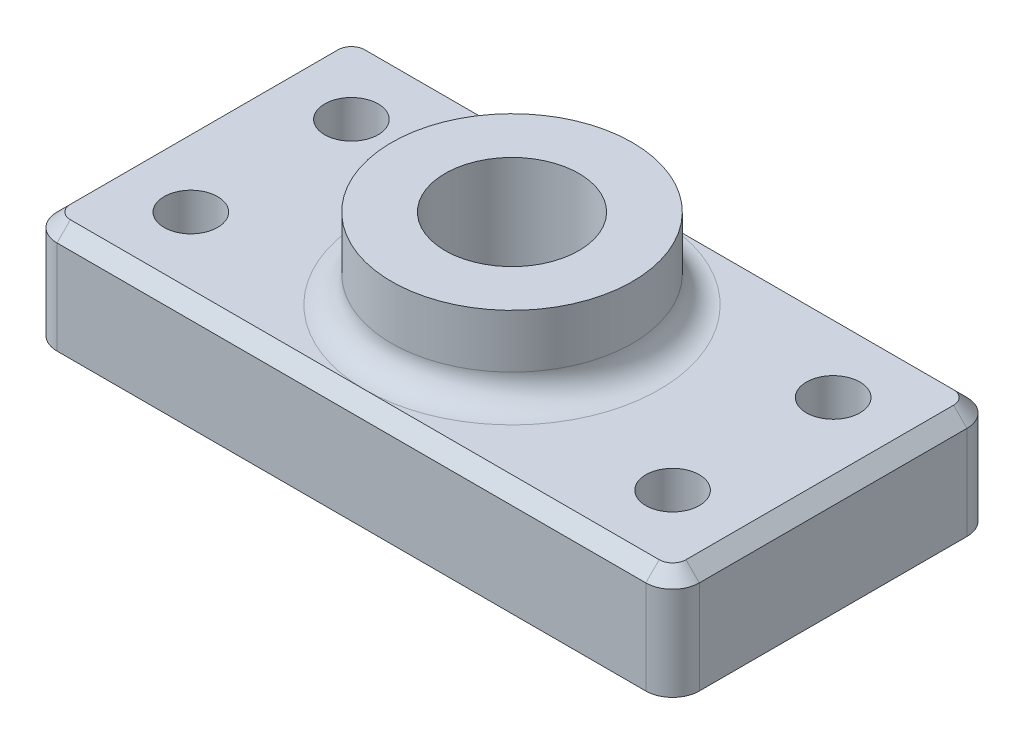
ISO-10303-21;
HEADER;
FILE_DESCRIPTION(('STEP AP214'),'2;1');
FILE_NAME('part.step','',(''),(''),'','','');
FILE_SCHEMA(('AUTOMOTIVE_DESIGN { 1 0 10303 214 1 1 1 1 }'));
ENDSEC;
DATA;
#1=APPLICATION_CONTEXT('core data for automotive mechanical design processes');
#2=APPLICATION_PROTOCOL_DEFINITION('international standard','automotive_design',2000,#1);
#3=PRODUCT_CONTEXT('',#1,'mechanical');
#4=PRODUCT('Part','Part','',(#3));
#5=PRODUCT_RELATED_PRODUCT_CATEGORY('part','',(#4));
#6=PRODUCT_DEFINITION_FORMATION('','',#4);
#7=PRODUCT_DEFINITION_CONTEXT('part definition',#1,'design');
#8=PRODUCT_DEFINITION('design','',#6,#7);
#9=PRODUCT_DEFINITION_SHAPE('','',#8);
#10=(LENGTH_UNIT() NAMED_UNIT(*) SI_UNIT(.MILLI.,.METRE.));
#11=(NAMED_UNIT(*) PLANE_ANGLE_UNIT() SI_UNIT($,.RADIAN.));
#12=(NAMED_UNIT(*) SI_UNIT($,.STERADIAN.) SOLID_ANGLE_UNIT());
#13=UNCERTAINTY_MEASURE_WITH_UNIT(LENGTH_MEASURE(1.E-05),#10,'distance_accuracy_value','');
#14=(GEOMETRIC_REPRESENTATION_CONTEXT(3) GLOBAL_UNCERTAINTY_ASSIGNED_CONTEXT((#13)) GLOBAL_UNIT_ASSIGNED_CONTEXT((#10,
#11,#12)) REPRESENTATION_CONTEXT('',''));
#15=CARTESIAN_POINT('',(0.,0.,0.));
#16=DIRECTION('',(0.,0.,1.));
#17=DIRECTION('',(1.,0.,0.));
#18=AXIS2_PLACEMENT_3D('',#15,#16,#17);
#19=CARTESIAN_POINT('',(0.,25.4,0.));
#20=DIRECTION('',(0.,-1.,0.));
#21=DIRECTION('',(0.,0.,-1.));
#22=AXIS2_PLACEMENT_3D('',#19,#20,#21);
#23=PLANE('',#22);
#24=CARTESIAN_POINT('',(133.35,25.4,-19.05));
#25=DIRECTION('',(0.,1.,0.));
#26=DIRECTION('',(0.,0.,1.));
#27=AXIS2_PLACEMENT_3D('',#24,#25,#26);
#28=CIRCLE('',#27,6.35);
#29=CARTESIAN_POINT('',(133.35,25.4,-12.7));
#30=VERTEX_POINT('',#29);
#31=EDGE_CURVE('E391',#30,#30,#28,.T.);
#32=ORIENTED_EDGE('',*,*,#31,.F.);
#33=EDGE_LOOP('',(#32));
#34=FACE_BOUND('',#33,.T.);
#35=DIRECTION('',(-1.,0.,0.));
#36=VECTOR('',#35,1.);
#37=CARTESIAN_POINT('',(0.,25.4,-73.025));
#38=LINE('',#37,#36);
#39=CARTESIAN_POINT('',(146.05,25.4,-73.025));
#40=VERTEX_POINT('',#39);
#41=CARTESIAN_POINT('',(76.2,25.4,-73.025));
#42=VERTEX_POINT('',#41);
#43=EDGE_CURVE('E230',#40,#42,#38,.T.);
#44=ORIENTED_EDGE('',*,*,#43,.T.);
#45=CARTESIAN_POINT('',(76.2,25.4,-38.1));
#46=DIRECTION('',(0.,-1.,0.));
#47=DIRECTION('',(0.,0.,-1.));
#48=AXIS2_PLACEMENT_3D('',#45,#46,#47);
#49=CIRCLE('',#48,34.925);
#50=CARTESIAN_POINT('',(76.2,25.4,-3.17500000000004));
#51=VERTEX_POINT('',#50);
#52=EDGE_CURVE('E11',#42,#51,#49,.T.);
#53=ORIENTED_EDGE('',*,*,#52,.T.);
#54=DIRECTION('',(1.,0.,0.));
#55=VECTOR('',#54,1.);
#56=CARTESIAN_POINT('',(0.,25.4,-3.17500000000004));
#57=LINE('',#56,#55);
#58=CARTESIAN_POINT('',(146.05,25.4,-3.17500000000004));
#59=VERTEX_POINT('',#58);
#60=EDGE_CURVE('E234',#51,#59,#57,.T.);
#61=ORIENTED_EDGE('',*,*,#60,.T.);
#62=CARTESIAN_POINT('',(146.05,25.4,-6.35));
#63=DIRECTION('',(0.,-1.,0.));
#64=DIRECTION('',(0.,0.,-1.));
#65=AXIS2_PLACEMENT_3D('',#62,#63,#64);
#66=CIRCLE('',#65,3.17499999999996);
#67=CARTESIAN_POINT('',(149.225,25.4,-6.35));
#68=VERTEX_POINT('',#67);
#69=EDGE_CURVE('E226',#59,#68,#66,.F.);
#70=ORIENTED_EDGE('',*,*,#69,.T.);
#71=DIRECTION('',(0.,0.,-1.));
#72=VECTOR('',#71,1.);
#73=CARTESIAN_POINT('',(149.225,25.4,0.));
#74=LINE('',#73,#72);
#75=CARTESIAN_POINT('',(149.225,25.4,-69.85));
#76=VERTEX_POINT('',#75);
#77=EDGE_CURVE('E220',#68,#76,#74,.T.);
#78=ORIENTED_EDGE('',*,*,#77,.T.);
#79=CARTESIAN_POINT('',(146.05,25.4,-69.85));
#80=DIRECTION('',(0.,-1.,0.));
#81=DIRECTION('',(0.,0.,-1.));
#82=AXIS2_PLACEMENT_3D('',#79,#80,#81);
#83=CIRCLE('',#82,3.17499999999996);
#84=EDGE_CURVE('E223',#76,#40,#83,.F.);
#85=ORIENTED_EDGE('',*,*,#84,.T.);
#86=EDGE_LOOP('',(#44,#53,#61,#70,#78,#85));
#87=FACE_BOUND('',#86,.T.);
#88=CARTESIAN_POINT('',(133.35,25.4,-57.15));
#89=DIRECTION('',(0.,-1.,0.));
#90=DIRECTION('',(0.,0.,-1.));
#91=AXIS2_PLACEMENT_3D('',#88,#89,#90);
#92=CIRCLE('',#91,6.34999999999997);
#93=CARTESIAN_POINT('',(133.35,25.4,-63.5));
#94=VERTEX_POINT('',#93);
#95=EDGE_CURVE('E390',#94,#94,#92,.T.);
#96=ORIENTED_EDGE('',*,*,#95,.T.);
#97=EDGE_LOOP('',(#96));
#98=FACE_BOUND('',#97,.T.);
#99=ADVANCED_FACE('F47',(#34,#87,#98),#23,.F.);
#100=CARTESIAN_POINT('',(19.0499999999998,25.4,-57.1499999999998));
#101=DIRECTION('',(0.,1.,0.));
#102=DIRECTION('',(0.,0.,1.));
#103=AXIS2_PLACEMENT_3D('',#100,#101,#102);
#104=CIRCLE('',#103,6.34999999999997);
#105=CARTESIAN_POINT('',(19.0499999999998,25.4,-50.7999999999998));
#106=VERTEX_POINT('',#105);
#107=EDGE_CURVE('E378',#106,#106,#104,.T.);
#108=ORIENTED_EDGE('',*,*,#107,.F.);
#109=EDGE_LOOP('',(#108));
#110=FACE_BOUND('',#109,.T.);
#111=CARTESIAN_POINT('',(6.35,25.4,-3.17500000000004));
#112=VERTEX_POINT('',#111);
#113=EDGE_CURVE('E235',#112,#51,#57,.T.);
#114=ORIENTED_EDGE('',*,*,#113,.T.);
#115=CARTESIAN_POINT('',(76.2,25.4,-38.1));
#116=DIRECTION('',(0.,-1.,0.));
#117=DIRECTION('',(0.,0.,-1.));
#118=AXIS2_PLACEMENT_3D('',#115,#116,#117);
#119=CIRCLE('',#118,34.925);
#120=EDGE_CURVE('E56',#51,#42,#119,.T.);
#121=ORIENTED_EDGE('',*,*,#120,.T.);
#122=CARTESIAN_POINT('',(6.35,25.4,-73.025));
#123=VERTEX_POINT('',#122);
#124=EDGE_CURVE('E229',#42,#123,#38,.T.);
#125=ORIENTED_EDGE('',*,*,#124,.T.);
#126=CARTESIAN_POINT('',(6.35,25.4,-69.85));
#127=DIRECTION('',(0.,-1.,0.));
#128=DIRECTION('',(0.,0.,-1.));
#129=AXIS2_PLACEMENT_3D('',#126,#127,#128);
#130=CIRCLE('',#129,3.17499999999996);
#131=CARTESIAN_POINT('',(3.17500000000004,25.4,-69.85));
#132=VERTEX_POINT('',#131);
#133=EDGE_CURVE('E238',#123,#132,#130,.F.);
#134=ORIENTED_EDGE('',*,*,#133,.T.);
#135=DIRECTION('',(0.,0.,1.));
#136=VECTOR('',#135,1.);
#137=CARTESIAN_POINT('',(3.17500000000004,25.4,0.));
#138=LINE('',#137,#136);
#139=CARTESIAN_POINT('',(3.17500000000004,25.4,-6.35));
#140=VERTEX_POINT('',#139);
#141=EDGE_CURVE('E244',#132,#140,#138,.T.);
#142=ORIENTED_EDGE('',*,*,#141,.T.);
#143=CARTESIAN_POINT('',(6.35,25.4,-6.35));
#144=DIRECTION('',(0.,-1.,0.));
#145=DIRECTION('',(0.,0.,-1.));
#146=AXIS2_PLACEMENT_3D('',#143,#144,#145);
#147=CIRCLE('',#146,3.17499999999996);
#148=EDGE_CURVE('E241',#140,#112,#147,.F.);
#149=ORIENTED_EDGE('',*,*,#148,.T.);
#150=EDGE_LOOP('',(#114,#121,#125,#134,#142,#149));
#151=FACE_BOUND('',#150,.T.);
#152=CARTESIAN_POINT('',(19.05,25.4,-19.0499999999998));
#153=DIRECTION('',(0.,-1.,0.));
#154=DIRECTION('',(0.,0.,-1.));
#155=AXIS2_PLACEMENT_3D('',#152,#153,#154);
#156=CIRCLE('',#155,6.34999999999999);
#157=CARTESIAN_POINT('',(19.05,25.4,-25.3999999999998));
#158=VERTEX_POINT('',#157);
#159=EDGE_CURVE('E382',#158,#158,#156,.T.);
#160=ORIENTED_EDGE('',*,*,#159,.T.);
#161=EDGE_LOOP('',(#160));
#162=FACE_BOUND('',#161,.T.);
#163=ADVANCED_FACE('F303',(#110,#151,#162),#23,.F.);
#164=CARTESIAN_POINT('',(0.,0.,0.));
#165=DIRECTION('',(0.,-1.,0.));
#166=DIRECTION('',(0.,0.,-1.));
#167=AXIS2_PLACEMENT_3D('',#164,#165,#166);
#168=PLANE('',#167);
#169=CARTESIAN_POINT('',(133.35,0.,-57.15));
#170=DIRECTION('',(0.,-1.,0.));
#171=DIRECTION('',(0.,0.,-1.));
#172=AXIS2_PLACEMENT_3D('',#169,#170,#171);
#173=CIRCLE('',#172,6.34999999999997);
#174=CARTESIAN_POINT('',(133.35,0.,-63.5));
#175=VERTEX_POINT('',#174);
#176=EDGE_CURVE('E386',#175,#175,#173,.T.);
#177=ORIENTED_EDGE('',*,*,#176,.F.);
#178=EDGE_LOOP('',(#177));
#179=FACE_BOUND('',#178,.T.);
#180=CARTESIAN_POINT('',(133.35,0.,-19.05));
#181=DIRECTION('',(0.,1.,0.));
#182=DIRECTION('',(0.,0.,1.));
#183=AXIS2_PLACEMENT_3D('',#180,#181,#182);
#184=CIRCLE('',#183,6.35);
#185=CARTESIAN_POINT('',(133.35,0.,-12.7));
#186=VERTEX_POINT('',#185);
#187=EDGE_CURVE('E402',#186,#186,#184,.T.);
#188=ORIENTED_EDGE('',*,*,#187,.T.);
#189=EDGE_LOOP('',(#188));
#190=FACE_BOUND('',#189,.T.);
#191=CARTESIAN_POINT('',(19.0499999999998,0.,-57.1499999999998));
#192=DIRECTION('',(0.,1.,0.));
#193=DIRECTION('',(0.,0.,1.));
#194=AXIS2_PLACEMENT_3D('',#191,#192,#193);
#195=CIRCLE('',#194,6.34999999999997);
#196=CARTESIAN_POINT('',(19.0499999999998,0.,-50.7999999999998));
#197=VERTEX_POINT('',#196);
#198=EDGE_CURVE('E376',#197,#197,#195,.T.);
#199=ORIENTED_EDGE('',*,*,#198,.T.);
#200=EDGE_LOOP('',(#199));
#201=FACE_BOUND('',#200,.T.);
#202=CARTESIAN_POINT('',(76.2,0.,-38.1));
#203=DIRECTION('',(0.,1.,0.));
#204=DIRECTION('',(0.,0.,1.));
#205=AXIS2_PLACEMENT_3D('',#202,#203,#204);
#206=CIRCLE('',#205,15.875);
#207=CARTESIAN_POINT('',(76.2,0.,-22.225));
#208=VERTEX_POINT('',#207);
#209=EDGE_CURVE('E367',#208,#208,#206,.T.);
#210=ORIENTED_EDGE('',*,*,#209,.T.);
#211=EDGE_LOOP('',(#210));
#212=FACE_BOUND('',#211,.T.);
#213=DIRECTION('',(0.,0.,1.));
#214=VECTOR('',#213,1.);
#215=CARTESIAN_POINT('',(0.,0.,0.));
#216=LINE('',#215,#214);
#217=CARTESIAN_POINT('',(0.,0.,-69.85));
#218=VERTEX_POINT('',#217);
#219=CARTESIAN_POINT('',(0.,0.,-6.35));
#220=VERTEX_POINT('',#219);
#221=EDGE_CURVE('E146',#218,#220,#216,.T.);
#222=ORIENTED_EDGE('',*,*,#221,.F.);
#223=CARTESIAN_POINT('',(6.35,0.,-69.85));
#224=DIRECTION('',(0.,-1.,0.));
#225=DIRECTION('',(0.,0.,-1.));
#226=AXIS2_PLACEMENT_3D('',#223,#224,#225);
#227=CIRCLE('',#226,6.35);
#228=CARTESIAN_POINT('',(6.35,0.,-76.2));
#229=VERTEX_POINT('',#228);
#230=EDGE_CURVE('E156',#218,#229,#227,.T.);
#231=ORIENTED_EDGE('',*,*,#230,.T.);
#232=DIRECTION('',(-1.,0.,0.));
#233=VECTOR('',#232,1.);
#234=CARTESIAN_POINT('',(0.,0.,-76.2));
#235=LINE('',#234,#233);
#236=CARTESIAN_POINT('',(146.05,0.,-76.2));
#237=VERTEX_POINT('',#236);
#238=EDGE_CURVE('E190',#237,#229,#235,.T.);
#239=ORIENTED_EDGE('',*,*,#238,.F.);
#240=CARTESIAN_POINT('',(146.05,0.,-69.85));
#241=DIRECTION('',(0.,-1.,0.));
#242=DIRECTION('',(0.,0.,-1.));
#243=AXIS2_PLACEMENT_3D('',#240,#241,#242);
#244=CIRCLE('',#243,6.35);
#245=CARTESIAN_POINT('',(152.4,0.,-69.85));
#246=VERTEX_POINT('',#245);
#247=EDGE_CURVE('E165',#237,#246,#244,.T.);
#248=ORIENTED_EDGE('',*,*,#247,.T.);
#249=DIRECTION('',(0.,0.,-1.));
#250=VECTOR('',#249,1.);
#251=CARTESIAN_POINT('',(152.4,0.,0.));
#252=LINE('',#251,#250);
#253=CARTESIAN_POINT('',(152.4,0.,-6.35));
#254=VERTEX_POINT('',#253);
#255=EDGE_CURVE('E178',#254,#246,#252,.T.);
#256=ORIENTED_EDGE('',*,*,#255,.F.);
#257=CARTESIAN_POINT('',(146.05,0.,-6.35));
#258=DIRECTION('',(0.,-1.,0.));
#259=DIRECTION('',(0.,0.,-1.));
#260=AXIS2_PLACEMENT_3D('',#257,#258,#259);
#261=CIRCLE('',#260,6.35);
#262=CARTESIAN_POINT('',(146.05,0.,0.));
#263=VERTEX_POINT('',#262);
#264=EDGE_CURVE('E197',#254,#263,#261,.T.);
#265=ORIENTED_EDGE('',*,*,#264,.T.);
#266=DIRECTION('',(1.,0.,0.));
#267=VECTOR('',#266,1.);
#268=CARTESIAN_POINT('',(0.,0.,0.));
#269=LINE('',#268,#267);
#270=CARTESIAN_POINT('',(6.35,0.,0.));
#271=VERTEX_POINT('',#270);
#272=EDGE_CURVE('E172',#271,#263,#269,.T.);
#273=ORIENTED_EDGE('',*,*,#272,.F.);
#274=CARTESIAN_POINT('',(6.35,0.,-6.35));
#275=DIRECTION('',(0.,-1.,0.));
#276=DIRECTION('',(0.,0.,-1.));
#277=AXIS2_PLACEMENT_3D('',#274,#275,#276);
#278=CIRCLE('',#277,6.35);
#279=EDGE_CURVE('E152',#271,#220,#278,.T.);
#280=ORIENTED_EDGE('',*,*,#279,.T.);
#281=EDGE_LOOP('',(#222,#231,#239,#248,#256,#265,#273,#280));
#282=FACE_BOUND('',#281,.T.);
#283=CARTESIAN_POINT('',(19.05,0.,-19.0499999999998));
#284=DIRECTION('',(0.,-1.,0.));
#285=DIRECTION('',(0.,0.,-1.));
#286=AXIS2_PLACEMENT_3D('',#283,#284,#285);
#287=CIRCLE('',#286,6.34999999999999);
#288=CARTESIAN_POINT('',(19.05,0.,-25.3999999999998));
#289=VERTEX_POINT('',#288);
#290=EDGE_CURVE('E395',#289,#289,#287,.T.);
#291=ORIENTED_EDGE('',*,*,#290,.F.);
#292=EDGE_LOOP('',(#291));
#293=FACE_BOUND('',#292,.T.);
#294=ADVANCED_FACE('F167',(#179,#190,#201,#212,#282,#293),#168,.T.);
#295=CARTESIAN_POINT('',(0.,25.4,0.));
#296=DIRECTION('',(1.,0.,0.));
#297=DIRECTION('',(0.,0.,-1.));
#298=AXIS2_PLACEMENT_3D('',#295,#296,#297);
#299=PLANE('',#298);
#300=DIRECTION('',(0.,-1.,0.));
#301=VECTOR('',#300,1.);
#302=CARTESIAN_POINT('',(0.,25.4,-6.35));
#303=LINE('',#302,#301);
#304=CARTESIAN_POINT('',(0.,22.225,-6.35));
#305=VERTEX_POINT('',#304);
#306=EDGE_CURVE('E153',#220,#305,#303,.F.);
#307=ORIENTED_EDGE('',*,*,#306,.T.);
#308=DIRECTION('',(0.,0.,-1.));
#309=VECTOR('',#308,1.);
#310=CARTESIAN_POINT('',(0.,22.225,0.));
#311=LINE('',#310,#309);
#312=CARTESIAN_POINT('',(0.,22.225,-69.85));
#313=VERTEX_POINT('',#312);
#314=EDGE_CURVE('E149',#305,#313,#311,.T.);
#315=ORIENTED_EDGE('',*,*,#314,.T.);
#316=DIRECTION('',(0.,-1.,0.));
#317=VECTOR('',#316,1.);
#318=CARTESIAN_POINT('',(0.,25.4,-69.85));
#319=LINE('',#318,#317);
#320=EDGE_CURVE('E141',#313,#218,#319,.T.);
#321=ORIENTED_EDGE('',*,*,#320,.T.);
#322=ORIENTED_EDGE('',*,*,#221,.T.);
#323=EDGE_LOOP('',(#307,#315,#321,#322));
#324=FACE_BOUND('',#323,.T.);
#325=ADVANCED_FACE('F144',(#324),#299,.F.);
#326=CARTESIAN_POINT('',(0.,25.4,0.));
#327=DIRECTION('',(0.,0.,-1.));
#328=DIRECTION('',(-1.,0.,0.));
#329=AXIS2_PLACEMENT_3D('',#326,#327,#328);
#330=PLANE('',#329);
#331=DIRECTION('',(0.,-1.,0.));
#332=VECTOR('',#331,1.);
#333=CARTESIAN_POINT('',(146.05,25.4,0.));
#334=LINE('',#333,#332);
#335=CARTESIAN_POINT('',(146.05,22.225,0.));
#336=VERTEX_POINT('',#335);
#337=EDGE_CURVE('E216',#263,#336,#334,.F.);
#338=ORIENTED_EDGE('',*,*,#337,.T.);
#339=DIRECTION('',(-1.,0.,0.));
#340=VECTOR('',#339,1.);
#341=CARTESIAN_POINT('',(0.,22.225,0.));
#342=LINE('',#341,#340);
#343=CARTESIAN_POINT('',(6.35,22.225,0.));
#344=VERTEX_POINT('',#343);
#345=EDGE_CURVE('E256',#336,#344,#342,.T.);
#346=ORIENTED_EDGE('',*,*,#345,.T.);
#347=DIRECTION('',(0.,-1.,0.));
#348=VECTOR('',#347,1.);
#349=CARTESIAN_POINT('',(6.35,25.4,0.));
#350=LINE('',#349,#348);
#351=EDGE_CURVE('E213',#344,#271,#350,.T.);
#352=ORIENTED_EDGE('',*,*,#351,.T.);
#353=ORIENTED_EDGE('',*,*,#272,.T.);
#354=EDGE_LOOP('',(#338,#346,#352,#353));
#355=FACE_BOUND('',#354,.T.);
#356=ADVANCED_FACE('F332',(#355),#330,.F.);
#357=CARTESIAN_POINT('',(152.4,25.4,0.));
#358=DIRECTION('',(-1.,0.,0.));
#359=DIRECTION('',(0.,0.,1.));
#360=AXIS2_PLACEMENT_3D('',#357,#358,#359);
#361=PLANE('',#360);
#362=DIRECTION('',(0.,-1.,0.));
#363=VECTOR('',#362,1.);
#364=CARTESIAN_POINT('',(152.4,25.4,-69.85));
#365=LINE('',#364,#363);
#366=CARTESIAN_POINT('',(152.4,22.225,-69.85));
#367=VERTEX_POINT('',#366);
#368=EDGE_CURVE('E209',#246,#367,#365,.F.);
#369=ORIENTED_EDGE('',*,*,#368,.T.);
#370=DIRECTION('',(0.,0.,1.));
#371=VECTOR('',#370,1.);
#372=CARTESIAN_POINT('',(152.4,22.225,0.));
#373=LINE('',#372,#371);
#374=CARTESIAN_POINT('',(152.4,22.225,-6.35));
#375=VERTEX_POINT('',#374);
#376=EDGE_CURVE('E268',#367,#375,#373,.T.);
#377=ORIENTED_EDGE('',*,*,#376,.T.);
#378=DIRECTION('',(0.,-1.,0.));
#379=VECTOR('',#378,1.);
#380=CARTESIAN_POINT('',(152.4,25.4,-6.35));
#381=LINE('',#380,#379);
#382=EDGE_CURVE('E206',#375,#254,#381,.T.);
#383=ORIENTED_EDGE('',*,*,#382,.T.);
#384=ORIENTED_EDGE('',*,*,#255,.T.);
#385=EDGE_LOOP('',(#369,#377,#383,#384));
#386=FACE_BOUND('',#385,.T.);
#387=ADVANCED_FACE('F426',(#386),#361,.F.);
#388=CARTESIAN_POINT('',(0.,25.4,-76.2));
#389=DIRECTION('',(0.,0.,1.));
#390=DIRECTION('',(1.,0.,0.));
#391=AXIS2_PLACEMENT_3D('',#388,#389,#390);
#392=PLANE('',#391);
#393=DIRECTION('',(0.,-1.,0.));
#394=VECTOR('',#393,1.);
#395=CARTESIAN_POINT('',(6.35,25.4,-76.2));
#396=LINE('',#395,#394);
#397=CARTESIAN_POINT('',(6.35,22.225,-76.2));
#398=VERTEX_POINT('',#397);
#399=EDGE_CURVE('E159',#229,#398,#396,.F.);
#400=ORIENTED_EDGE('',*,*,#399,.T.);
#401=DIRECTION('',(1.,0.,0.));
#402=VECTOR('',#401,1.);
#403=CARTESIAN_POINT('',(0.,22.225,-76.2));
#404=LINE('',#403,#402);
#405=CARTESIAN_POINT('',(146.05,22.225,-76.2));
#406=VERTEX_POINT('',#405);
#407=EDGE_CURVE('E259',#398,#406,#404,.T.);
#408=ORIENTED_EDGE('',*,*,#407,.T.);
#409=DIRECTION('',(0.,-1.,0.));
#410=VECTOR('',#409,1.);
#411=CARTESIAN_POINT('',(146.05,25.4,-76.2));
#412=LINE('',#411,#410);
#413=EDGE_CURVE('E164',#406,#237,#412,.T.);
#414=ORIENTED_EDGE('',*,*,#413,.T.);
#415=ORIENTED_EDGE('',*,*,#238,.T.);
#416=EDGE_LOOP('',(#400,#408,#414,#415));
#417=FACE_BOUND('',#416,.T.);
#418=ADVANCED_FACE('F423',(#417),#392,.F.);
#419=CARTESIAN_POINT('',(6.35,25.4,-69.85));
#420=DIRECTION('',(0.,-1.,0.));
#421=DIRECTION('',(0.,0.,-1.));
#422=AXIS2_PLACEMENT_3D('',#419,#420,#421);
#423=CYLINDRICAL_SURFACE('',#422,6.35);
#424=ORIENTED_EDGE('',*,*,#320,.F.);
#425=CARTESIAN_POINT('',(6.35,22.225,-69.85));
#426=DIRECTION('',(0.,-1.,0.));
#427=DIRECTION('',(0.,0.,-1.));
#428=AXIS2_PLACEMENT_3D('',#425,#426,#427);
#429=CIRCLE('',#428,6.35);
#430=EDGE_CURVE('E253',#313,#398,#429,.T.);
#431=ORIENTED_EDGE('',*,*,#430,.T.);
#432=ORIENTED_EDGE('',*,*,#399,.F.);
#433=ORIENTED_EDGE('',*,*,#230,.F.);
#434=EDGE_LOOP('',(#424,#431,#432,#433));
#435=FACE_BOUND('',#434,.T.);
#436=ADVANCED_FACE('F157',(#435),#423,.T.);
#437=CARTESIAN_POINT('',(146.05,25.4,-69.85));
#438=DIRECTION('',(0.,-1.,0.));
#439=DIRECTION('',(0.,0.,-1.));
#440=AXIS2_PLACEMENT_3D('',#437,#438,#439);
#441=CYLINDRICAL_SURFACE('',#440,6.35);
#442=ORIENTED_EDGE('',*,*,#413,.F.);
#443=CARTESIAN_POINT('',(146.05,22.225,-69.85));
#444=DIRECTION('',(0.,-1.,0.));
#445=DIRECTION('',(0.,0.,-1.));
#446=AXIS2_PLACEMENT_3D('',#443,#444,#445);
#447=CIRCLE('',#446,6.35);
#448=EDGE_CURVE('E265',#406,#367,#447,.T.);
#449=ORIENTED_EDGE('',*,*,#448,.T.);
#450=ORIENTED_EDGE('',*,*,#368,.F.);
#451=ORIENTED_EDGE('',*,*,#247,.F.);
#452=EDGE_LOOP('',(#442,#449,#450,#451));
#453=FACE_BOUND('',#452,.T.);
#454=ADVANCED_FACE('F437',(#453),#441,.T.);
#455=CARTESIAN_POINT('',(146.05,25.4,-6.35));
#456=DIRECTION('',(0.,-1.,0.));
#457=DIRECTION('',(0.,0.,-1.));
#458=AXIS2_PLACEMENT_3D('',#455,#456,#457);
#459=CYLINDRICAL_SURFACE('',#458,6.35);
#460=ORIENTED_EDGE('',*,*,#382,.F.);
#461=CARTESIAN_POINT('',(146.05,22.225,-6.35));
#462=DIRECTION('',(0.,-1.,0.));
#463=DIRECTION('',(0.,0.,-1.));
#464=AXIS2_PLACEMENT_3D('',#461,#462,#463);
#465=CIRCLE('',#464,6.35);
#466=EDGE_CURVE('E262',#375,#336,#465,.T.);
#467=ORIENTED_EDGE('',*,*,#466,.T.);
#468=ORIENTED_EDGE('',*,*,#337,.F.);
#469=ORIENTED_EDGE('',*,*,#264,.F.);
#470=EDGE_LOOP('',(#460,#467,#468,#469));
#471=FACE_BOUND('',#470,.T.);
#472=ADVANCED_FACE('F440',(#471),#459,.T.);
#473=CARTESIAN_POINT('',(6.35,25.4,-6.35));
#474=DIRECTION('',(0.,-1.,0.));
#475=DIRECTION('',(0.,0.,-1.));
#476=AXIS2_PLACEMENT_3D('',#473,#474,#475);
#477=CYLINDRICAL_SURFACE('',#476,6.35);
#478=ORIENTED_EDGE('',*,*,#351,.F.);
#479=CARTESIAN_POINT('',(6.35,22.225,-6.35));
#480=DIRECTION('',(0.,-1.,0.));
#481=DIRECTION('',(0.,0.,-1.));
#482=AXIS2_PLACEMENT_3D('',#479,#480,#481);
#483=CIRCLE('',#482,6.35);
#484=EDGE_CURVE('E250',#344,#305,#483,.T.);
#485=ORIENTED_EDGE('',*,*,#484,.T.);
#486=ORIENTED_EDGE('',*,*,#306,.F.);
#487=ORIENTED_EDGE('',*,*,#279,.F.);
#488=EDGE_LOOP('',(#478,#485,#486,#487));
#489=FACE_BOUND('',#488,.T.);
#490=ADVANCED_FACE('F330',(#489),#477,.T.);
#491=CARTESIAN_POINT('',(149.225,25.4,0.));
#492=DIRECTION('',(-0.707106781186546,-0.707106781186549,0.));
#493=DIRECTION('',(0.,0.,-1.));
#494=AXIS2_PLACEMENT_3D('',#491,#492,#493);
#495=PLANE('',#494);
#496=DIRECTION('',(-0.707106781186549,0.707106781186546,0.));
#497=VECTOR('',#496,1.);
#498=CARTESIAN_POINT('',(152.4,22.225,-6.35));
#499=LINE('',#498,#497);
#500=EDGE_CURVE('E181',#375,#68,#499,.T.);
#501=ORIENTED_EDGE('',*,*,#500,.F.);
#502=ORIENTED_EDGE('',*,*,#376,.F.);
#503=DIRECTION('',(0.707106781186549,-0.707106781186546,0.));
#504=VECTOR('',#503,1.);
#505=CARTESIAN_POINT('',(149.225,25.4,-69.85));
#506=LINE('',#505,#504);
#507=EDGE_CURVE('E173',#76,#367,#506,.T.);
#508=ORIENTED_EDGE('',*,*,#507,.F.);
#509=ORIENTED_EDGE('',*,*,#77,.F.);
#510=EDGE_LOOP('',(#501,#502,#508,#509));
#511=FACE_BOUND('',#510,.T.);
#512=ADVANCED_FACE('F345',(#511),#495,.F.);
#513=CARTESIAN_POINT('',(146.05,25.4,-69.85));
#514=DIRECTION('',(0.,-1.,0.));
#515=DIRECTION('',(0.,0.,-1.));
#516=AXIS2_PLACEMENT_3D('',#513,#514,#515);
#517=CONICAL_SURFACE('',#516,3.17499999999996,0.785398163397451);
#518=ORIENTED_EDGE('',*,*,#507,.T.);
#519=ORIENTED_EDGE('',*,*,#448,.F.);
#520=DIRECTION('',(0.,-0.707106781186546,-0.707106781186549));
#521=VECTOR('',#520,1.);
#522=CARTESIAN_POINT('',(146.05,25.4,-73.025));
#523=LINE('',#522,#521);
#524=EDGE_CURVE('E290',#40,#406,#523,.T.);
#525=ORIENTED_EDGE('',*,*,#524,.F.);
#526=ORIENTED_EDGE('',*,*,#84,.F.);
#527=EDGE_LOOP('',(#518,#519,#525,#526));
#528=FACE_BOUND('',#527,.T.);
#529=ADVANCED_FACE('F351',(#528),#517,.T.);
#530=CARTESIAN_POINT('',(146.05,25.4,-6.35));
#531=DIRECTION('',(0.,-1.,0.));
#532=DIRECTION('',(0.,0.,-1.));
#533=AXIS2_PLACEMENT_3D('',#530,#531,#532);
#534=CONICAL_SURFACE('',#533,3.17499999999996,0.785398163397451);
#535=ORIENTED_EDGE('',*,*,#500,.T.);
#536=ORIENTED_EDGE('',*,*,#69,.F.);
#537=DIRECTION('',(0.,0.707106781186545,-0.70710678118655));
#538=VECTOR('',#537,1.);
#539=CARTESIAN_POINT('',(146.05,22.225,0.));
#540=LINE('',#539,#538);
#541=EDGE_CURVE('E286',#336,#59,#540,.T.);
#542=ORIENTED_EDGE('',*,*,#541,.F.);
#543=ORIENTED_EDGE('',*,*,#466,.F.);
#544=EDGE_LOOP('',(#535,#536,#542,#543));
#545=FACE_BOUND('',#544,.T.);
#546=ADVANCED_FACE('F338',(#545),#534,.T.);
#547=CARTESIAN_POINT('',(0.,25.4,-73.025));
#548=DIRECTION('',(0.,-0.707106781186549,0.707106781186546));
#549=DIRECTION('',(-1.,0.,0.));
#550=AXIS2_PLACEMENT_3D('',#547,#548,#549);
#551=PLANE('',#550);
#552=ORIENTED_EDGE('',*,*,#524,.T.);
#553=ORIENTED_EDGE('',*,*,#407,.F.);
#554=DIRECTION('',(0.,-0.707106781186546,-0.707106781186549));
#555=VECTOR('',#554,1.);
#556=CARTESIAN_POINT('',(6.35,25.4,-73.025));
#557=LINE('',#556,#555);
#558=EDGE_CURVE('E282',#123,#398,#557,.T.);
#559=ORIENTED_EDGE('',*,*,#558,.F.);
#560=ORIENTED_EDGE('',*,*,#124,.F.);
#561=ORIENTED_EDGE('',*,*,#43,.F.);
#562=EDGE_LOOP('',(#552,#553,#559,#560,#561));
#563=FACE_BOUND('',#562,.T.);
#564=ADVANCED_FACE('F310',(#563),#551,.F.);
#565=CARTESIAN_POINT('',(0.,25.4,-3.17500000000004));
#566=DIRECTION('',(0.,-0.707106781186549,-0.707106781186546));
#567=DIRECTION('',(1.,0.,0.));
#568=AXIS2_PLACEMENT_3D('',#565,#566,#567);
#569=PLANE('',#568);
#570=ORIENTED_EDGE('',*,*,#541,.T.);
#571=ORIENTED_EDGE('',*,*,#60,.F.);
#572=ORIENTED_EDGE('',*,*,#113,.F.);
#573=DIRECTION('',(0.,0.707106781186546,-0.707106781186549));
#574=VECTOR('',#573,1.);
#575=CARTESIAN_POINT('',(6.35,22.225,0.));
#576=LINE('',#575,#574);
#577=EDGE_CURVE('E278',#344,#112,#576,.T.);
#578=ORIENTED_EDGE('',*,*,#577,.F.);
#579=ORIENTED_EDGE('',*,*,#345,.F.);
#580=EDGE_LOOP('',(#570,#571,#572,#578,#579));
#581=FACE_BOUND('',#580,.T.);
#582=ADVANCED_FACE('F324',(#581),#569,.F.);
#583=CARTESIAN_POINT('',(6.35,25.4,-69.85));
#584=DIRECTION('',(0.,-1.,0.));
#585=DIRECTION('',(0.,0.,-1.));
#586=AXIS2_PLACEMENT_3D('',#583,#584,#585);
#587=CONICAL_SURFACE('',#586,3.17499999999996,0.78539816339745);
#588=ORIENTED_EDGE('',*,*,#558,.T.);
#589=ORIENTED_EDGE('',*,*,#430,.F.);
#590=DIRECTION('',(-0.707106781186549,-0.707106781186546,0.));
#591=VECTOR('',#590,1.);
#592=CARTESIAN_POINT('',(3.17500000000004,25.4,-69.85));
#593=LINE('',#592,#591);
#594=EDGE_CURVE('E275',#132,#313,#593,.T.);
#595=ORIENTED_EDGE('',*,*,#594,.F.);
#596=ORIENTED_EDGE('',*,*,#133,.F.);
#597=EDGE_LOOP('',(#588,#589,#595,#596));
#598=FACE_BOUND('',#597,.T.);
#599=ADVANCED_FACE('F313',(#598),#587,.T.);
#600=CARTESIAN_POINT('',(6.35,25.4,-6.35));
#601=DIRECTION('',(0.,-1.,0.));
#602=DIRECTION('',(0.,0.,-1.));
#603=AXIS2_PLACEMENT_3D('',#600,#601,#602);
#604=CONICAL_SURFACE('',#603,3.17499999999996,0.78539816339745);
#605=ORIENTED_EDGE('',*,*,#577,.T.);
#606=ORIENTED_EDGE('',*,*,#148,.F.);
#607=DIRECTION('',(0.707106781186549,0.707106781186546,0.));
#608=VECTOR('',#607,1.);
#609=CARTESIAN_POINT('',(0.,22.225,-6.35));
#610=LINE('',#609,#608);
#611=EDGE_CURVE('E272',#305,#140,#610,.T.);
#612=ORIENTED_EDGE('',*,*,#611,.F.);
#613=ORIENTED_EDGE('',*,*,#484,.F.);
#614=EDGE_LOOP('',(#605,#606,#612,#613));
#615=FACE_BOUND('',#614,.T.);
#616=ADVANCED_FACE('F327',(#615),#604,.T.);
#617=CARTESIAN_POINT('',(3.17500000000004,25.4,0.));
#618=DIRECTION('',(0.707106781186546,-0.707106781186549,0.));
#619=DIRECTION('',(0.,0.,1.));
#620=AXIS2_PLACEMENT_3D('',#617,#618,#619);
#621=PLANE('',#620);
#622=ORIENTED_EDGE('',*,*,#594,.T.);
#623=ORIENTED_EDGE('',*,*,#314,.F.);
#624=ORIENTED_EDGE('',*,*,#611,.T.);
#625=ORIENTED_EDGE('',*,*,#141,.F.);
#626=EDGE_LOOP('',(#622,#623,#624,#625));
#627=FACE_BOUND('',#626,.T.);
#628=ADVANCED_FACE('F316',(#627),#621,.F.);
#629=CARTESIAN_POINT('',(76.2,44.45,-38.1));
#630=DIRECTION('',(0.,-1.,0.));
#631=DIRECTION('',(0.,0.,-1.));
#632=AXIS2_PLACEMENT_3D('',#629,#630,#631);
#633=CYLINDRICAL_SURFACE('',#632,28.575);
#634=CARTESIAN_POINT('',(76.2,31.75,-38.1));
#635=DIRECTION('',(0.,-1.,0.));
#636=DIRECTION('',(0.,0.,-1.));
#637=AXIS2_PLACEMENT_3D('',#634,#635,#636);
#638=CIRCLE('',#637,28.575);
#639=CARTESIAN_POINT('',(76.2,31.75,-66.675));
#640=VERTEX_POINT('',#639);
#641=EDGE_CURVE('E271',#640,#640,#638,.F.);
#642=CARTESIAN_POINT('',(76.2,44.45,-38.1));
#643=DIRECTION('',(0.,1.,0.));
#644=DIRECTION('',(0.,0.,1.));
#645=AXIS2_PLACEMENT_3D('',#642,#643,#644);
#646=CIRCLE('',#645,28.575);
#647=CARTESIAN_POINT('',(76.2,44.45,-66.675));
#648=VERTEX_POINT('',#647);
#649=EDGE_CURVE('E184',#648,#648,#646,.T.);
#650=CARTESIAN_POINT('',(76.2,31.75,-66.675));
#651=CARTESIAN_POINT('',(76.2,31.8822916666667,-66.675));
#652=CARTESIAN_POINT('',(76.2,32.0145833333333,-66.675));
#653=CARTESIAN_POINT('',(76.2,32.2791666666667,-66.675));
#654=CARTESIAN_POINT('',(76.2,32.4114583333333,-66.675));
#655=CARTESIAN_POINT('',(76.2,32.6760416666667,-66.675));
#656=CARTESIAN_POINT('',(76.2,32.8083333333333,-66.675));
#657=CARTESIAN_POINT('',(76.2,33.0729166666667,-66.675));
#658=CARTESIAN_POINT('',(76.2,33.2052083333333,-66.675));
#659=CARTESIAN_POINT('',(76.2,33.4697916666667,-66.675));
#660=CARTESIAN_POINT('',(76.2,33.6020833333333,-66.675));
#661=CARTESIAN_POINT('',(76.2,33.8666666666667,-66.675));
#662=CARTESIAN_POINT('',(76.2,33.9989583333333,-66.675));
#663=CARTESIAN_POINT('',(76.2,34.2635416666667,-66.675));
#664=CARTESIAN_POINT('',(76.2,34.3958333333333,-66.675));
#665=CARTESIAN_POINT('',(76.2,34.6604166666667,-66.675));
#666=CARTESIAN_POINT('',(76.2,34.7927083333333,-66.675));
#667=CARTESIAN_POINT('',(76.2,35.0572916666667,-66.675));
#668=CARTESIAN_POINT('',(76.2,35.1895833333333,-66.675));
#669=CARTESIAN_POINT('',(76.2,35.4541666666667,-66.675));
#670=CARTESIAN_POINT('',(76.2,35.5864583333333,-66.675));
#671=CARTESIAN_POINT('',(76.2,35.8510416666667,-66.675));
#672=CARTESIAN_POINT('',(76.2,35.9833333333333,-66.675));
#673=CARTESIAN_POINT('',(76.2,36.2479166666667,-66.675));
#674=CARTESIAN_POINT('',(76.2,36.3802083333333,-66.675));
#675=CARTESIAN_POINT('',(76.2,36.6447916666667,-66.675));
#676=CARTESIAN_POINT('',(76.2,36.7770833333333,-66.675));
#677=CARTESIAN_POINT('',(76.2,37.0416666666667,-66.675));
#678=CARTESIAN_POINT('',(76.2,37.1739583333333,-66.675));
#679=CARTESIAN_POINT('',(76.2,37.4385416666667,-66.675));
#680=CARTESIAN_POINT('',(76.2,37.5708333333333,-66.675));
#681=CARTESIAN_POINT('',(76.2,37.8354166666667,-66.675));
#682=CARTESIAN_POINT('',(76.2,37.9677083333333,-66.675));
#683=CARTESIAN_POINT('',(76.2,38.2322916666667,-66.675));
#684=CARTESIAN_POINT('',(76.2,38.3645833333333,-66.675));
#685=CARTESIAN_POINT('',(76.2,38.6291666666667,-66.675));
#686=CARTESIAN_POINT('',(76.2,38.7614583333333,-66.675));
#687=CARTESIAN_POINT('',(76.2,39.0260416666667,-66.675));
#688=CARTESIAN_POINT('',(76.2,39.1583333333333,-66.675));
#689=CARTESIAN_POINT('',(76.2,39.4229166666667,-66.675));
#690=CARTESIAN_POINT('',(76.2,39.5552083333333,-66.675));
#691=CARTESIAN_POINT('',(76.2,39.8197916666667,-66.675));
#692=CARTESIAN_POINT('',(76.2,39.9520833333333,-66.675));
#693=CARTESIAN_POINT('',(76.2,40.2166666666667,-66.675));
#694=CARTESIAN_POINT('',(76.2,40.3489583333333,-66.675));
#695=CARTESIAN_POINT('',(76.2,40.6135416666667,-66.675));
#696=CARTESIAN_POINT('',(76.2,40.7458333333333,-66.675));
#697=CARTESIAN_POINT('',(76.2,41.0104166666667,-66.675));
#698=CARTESIAN_POINT('',(76.2,41.1427083333333,-66.675));
#699=CARTESIAN_POINT('',(76.2,41.4072916666667,-66.675));
#700=CARTESIAN_POINT('',(76.2,41.5395833333333,-66.675));
#701=CARTESIAN_POINT('',(76.2,41.8041666666667,-66.675));
#702=CARTESIAN_POINT('',(76.2,41.9364583333333,-66.675));
#703=CARTESIAN_POINT('',(76.2,42.2010416666667,-66.675));
#704=CARTESIAN_POINT('',(76.2,42.3333333333333,-66.675));
#705=CARTESIAN_POINT('',(76.2,42.5979166666667,-66.675));
#706=CARTESIAN_POINT('',(76.2,42.7302083333333,-66.675));
#707=CARTESIAN_POINT('',(76.2,42.9947916666667,-66.675));
#708=CARTESIAN_POINT('',(76.2,43.1270833333333,-66.675));
#709=CARTESIAN_POINT('',(76.2,43.3916666666667,-66.675));
#710=CARTESIAN_POINT('',(76.2,43.5239583333333,-66.675));
#711=CARTESIAN_POINT('',(76.2,43.7885416666667,-66.675));
#712=CARTESIAN_POINT('',(76.2,43.9208333333333,-66.675));
#713=CARTESIAN_POINT('',(76.2,44.1854166666667,-66.675));
#714=CARTESIAN_POINT('',(76.2,44.3177083333333,-66.675));
#715=CARTESIAN_POINT('',(76.2,44.45,-66.675));
#716=B_SPLINE_CURVE_WITH_KNOTS('',3,(#650,#651,#652,#653,#654,#655,#656,#657,#658,#659,#660,
#661,#662,#663,#664,#665,#666,#667,#668,#669,#670,#671,#672,#673,#674,#675,#676,#677,#678,#679,
#680,#681,#682,#683,#684,#685,#686,#687,#688,#689,#690,#691,#692,#693,#694,#695,#696,#697,#698,
#699,#700,#701,#702,#703,#704,#705,#706,#707,#708,#709,#710,#711,#712,#713,#714,#715),
.UNSPECIFIED.,.F.,.F.,(4,2,2,2,2,2,2,2,2,2,2,2,2,2,2,2,2,2,2,2,2,2,2,2,2,2,2,2,2,2,2,2,4),(0.,
0.396874999999998,0.793749999999996,1.19062499999999,1.5875,1.984375,2.38124999999999,2.778125,
3.175,3.571875,3.96875,4.365625,4.7625,5.15937499999999,5.55625,5.953125,6.34999999999999,
6.74687499999999,7.14375,7.540625,7.93749999999999,8.334375,8.73125,9.12812499999999,
9.52499999999999,9.921875,10.31875,10.715625,11.1125,11.509375,11.90625,12.303125,12.7),.UNSPECIFIED.);
#717=EDGE_CURVE('BSEAM358',#640,#648,#716,.T.);
#718=ORIENTED_EDGE('',*,*,#641,.T.);
#719=ORIENTED_EDGE('',*,*,#649,.F.);
#720=ORIENTED_EDGE('',*,*,#717,.T.);
#721=ORIENTED_EDGE('',*,*,#717,.F.);
#722=EDGE_LOOP('',(#718,#720,#719,#721));
#723=FACE_BOUND('',#722,.T.);
#724=ADVANCED_FACE('F358',(#723),#633,.T.);
#725=CARTESIAN_POINT('',(76.2,44.45,-38.1));
#726=DIRECTION('',(0.,1.,0.));
#727=DIRECTION('',(0.,0.,1.));
#728=AXIS2_PLACEMENT_3D('',#725,#726,#727);
#729=PLANE('',#728);
#730=CARTESIAN_POINT('',(76.2,44.45,-38.1));
#731=DIRECTION('',(0.,1.,0.));
#732=DIRECTION('',(0.,0.,1.));
#733=AXIS2_PLACEMENT_3D('',#730,#731,#732);
#734=CIRCLE('',#733,15.875);
#735=CARTESIAN_POINT('',(76.2,44.45,-22.225));
#736=VERTEX_POINT('',#735);
#737=EDGE_CURVE('E370',#736,#736,#734,.T.);
#738=ORIENTED_EDGE('',*,*,#737,.F.);
#739=EDGE_LOOP('',(#738));
#740=FACE_BOUND('',#739,.T.);
#741=ORIENTED_EDGE('',*,*,#649,.T.);
#742=EDGE_LOOP('',(#741));
#743=FACE_BOUND('',#742,.T.);
#744=ADVANCED_FACE('F361',(#740,#743),#729,.T.);
#745=CARTESIAN_POINT('',(76.2,0.,-38.1));
#746=DIRECTION('',(0.,1.,0.));
#747=DIRECTION('',(0.,0.,1.));
#748=AXIS2_PLACEMENT_3D('',#745,#746,#747);
#749=CYLINDRICAL_SURFACE('',#748,15.875);
#750=ORIENTED_EDGE('',*,*,#209,.F.);
#751=EDGE_LOOP('',(#750));
#752=FACE_BOUND('',#751,.T.);
#753=ORIENTED_EDGE('',*,*,#737,.T.);
#754=EDGE_LOOP('',(#753));
#755=FACE_BOUND('',#754,.T.);
#756=ADVANCED_FACE('F355',(#752,#755),#749,.F.);
#757=CARTESIAN_POINT('',(76.2,31.75,-38.1));
#758=DIRECTION('',(0.,-1.,0.));
#759=DIRECTION('',(0.,0.,-1.));
#760=AXIS2_PLACEMENT_3D('',#757,#758,#759);
#761=TOROIDAL_SURFACE('',#760,34.925,6.35);
#762=ORIENTED_EDGE('',*,*,#120,.F.);
#763=ORIENTED_EDGE('',*,*,#52,.F.);
#764=EDGE_LOOP('',(#762,#763));
#765=FACE_BOUND('',#764,.T.);
#766=ORIENTED_EDGE('',*,*,#641,.F.);
#767=EDGE_LOOP('',(#766));
#768=FACE_BOUND('',#767,.T.);
#769=ADVANCED_FACE('F49',(#765,#768),#761,.F.);
#770=CARTESIAN_POINT('',(19.0499999999998,0.,-57.1499999999998));
#771=DIRECTION('',(0.,1.,0.));
#772=DIRECTION('',(0.,0.,1.));
#773=AXIS2_PLACEMENT_3D('',#770,#771,#772);
#774=CYLINDRICAL_SURFACE('',#773,6.34999999999997);
#775=ORIENTED_EDGE('',*,*,#198,.F.);
#776=EDGE_LOOP('',(#775));
#777=FACE_BOUND('',#776,.T.);
#778=ORIENTED_EDGE('',*,*,#107,.T.);
#779=EDGE_LOOP('',(#778));
#780=FACE_BOUND('',#779,.T.);
#781=ADVANCED_FACE('F354',(#777,#780),#774,.F.);
#782=CARTESIAN_POINT('',(133.35,0.,-19.05));
#783=DIRECTION('',(0.,1.,0.));
#784=DIRECTION('',(0.,0.,1.));
#785=AXIS2_PLACEMENT_3D('',#782,#783,#784);
#786=CYLINDRICAL_SURFACE('',#785,6.35);
#787=ORIENTED_EDGE('',*,*,#187,.F.);
#788=EDGE_LOOP('',(#787));
#789=FACE_BOUND('',#788,.T.);
#790=ORIENTED_EDGE('',*,*,#31,.T.);
#791=EDGE_LOOP('',(#790));
#792=FACE_BOUND('',#791,.T.);
#793=ADVANCED_FACE('F410',(#789,#792),#786,.F.);
#794=CARTESIAN_POINT('',(133.35,0.,-57.15));
#795=DIRECTION('',(0.,1.,0.));
#796=DIRECTION('',(0.,0.,1.));
#797=AXIS2_PLACEMENT_3D('',#794,#795,#796);
#798=CYLINDRICAL_SURFACE('',#797,6.34999999999997);
#799=ORIENTED_EDGE('',*,*,#176,.T.);
#800=EDGE_LOOP('',(#799));
#801=FACE_BOUND('',#800,.T.);
#802=ORIENTED_EDGE('',*,*,#95,.F.);
#803=EDGE_LOOP('',(#802));
#804=FACE_BOUND('',#803,.T.);
#805=ADVANCED_FACE('F583',(#801,#804),#798,.F.);
#806=CARTESIAN_POINT('',(19.05,0.,-19.0499999999998));
#807=DIRECTION('',(0.,1.,0.));
#808=DIRECTION('',(0.,0.,1.));
#809=AXIS2_PLACEMENT_3D('',#806,#807,#808);
#810=CYLINDRICAL_SURFACE('',#809,6.34999999999999);
#811=ORIENTED_EDGE('',*,*,#290,.T.);
#812=EDGE_LOOP('',(#811));
#813=FACE_BOUND('',#812,.T.);
#814=ORIENTED_EDGE('',*,*,#159,.F.);
#815=EDGE_LOOP('',(#814));
#816=FACE_BOUND('',#815,.T.);
#817=ADVANCED_FACE('F593',(#813,#816),#810,.F.);
#818=CLOSED_SHELL('',(#99,#163,#294,#325,#356,#387,#418,#436,#454,#472,#490,#512,#529,#546,#564,
#582,#599,#616,#628,#724,#744,#756,#769,#781,#793,#805,#817));
#819=MANIFOLD_SOLID_BREP('B2',#818);
#820=ADVANCED_BREP_SHAPE_REPRESENTATION('',(#18,#819),#14);
#821=SHAPE_DEFINITION_REPRESENTATION(#9,#820);
ENDSEC;
END-ISO-10303-21;
